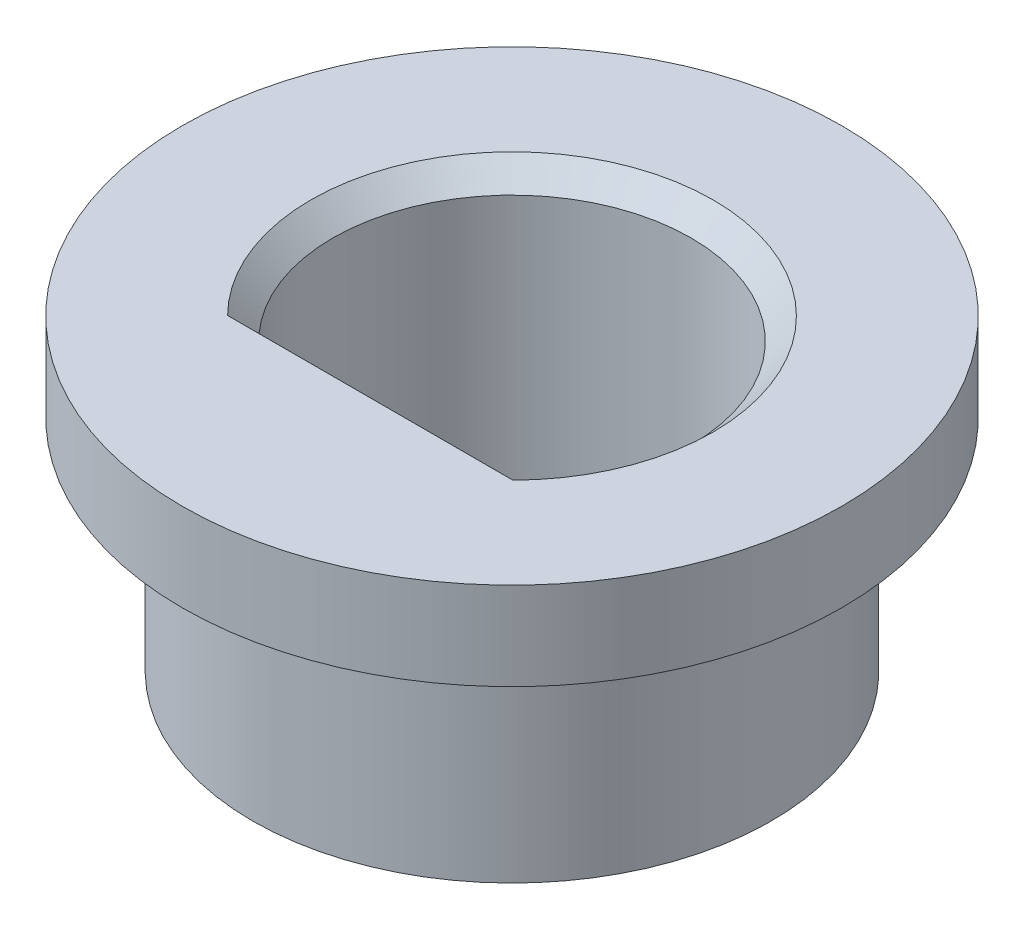
ISO-10303-21;
HEADER;
FILE_DESCRIPTION(('STEP AP214'),'2;1');
FILE_NAME('part.step','',(''),(''),'','','');
FILE_SCHEMA(('AUTOMOTIVE_DESIGN { 1 0 10303 214 1 1 1 1 }'));
ENDSEC;
DATA;
#1=APPLICATION_CONTEXT('core data for automotive mechanical design processes');
#2=APPLICATION_PROTOCOL_DEFINITION('international standard','automotive_design',2000,#1);
#3=PRODUCT_CONTEXT('',#1,'mechanical');
#4=PRODUCT('Part','Part','',(#3));
#5=PRODUCT_RELATED_PRODUCT_CATEGORY('part','',(#4));
#6=PRODUCT_DEFINITION_FORMATION('','',#4);
#7=PRODUCT_DEFINITION_CONTEXT('part definition',#1,'design');
#8=PRODUCT_DEFINITION('design','',#6,#7);
#9=PRODUCT_DEFINITION_SHAPE('','',#8);
#10=(LENGTH_UNIT() NAMED_UNIT(*) SI_UNIT(.MILLI.,.METRE.));
#11=(NAMED_UNIT(*) PLANE_ANGLE_UNIT() SI_UNIT($,.RADIAN.));
#12=(NAMED_UNIT(*) SI_UNIT($,.STERADIAN.) SOLID_ANGLE_UNIT());
#13=UNCERTAINTY_MEASURE_WITH_UNIT(LENGTH_MEASURE(1.E-05),#10,'distance_accuracy_value','');
#14=(GEOMETRIC_REPRESENTATION_CONTEXT(3) GLOBAL_UNCERTAINTY_ASSIGNED_CONTEXT((#13)) GLOBAL_UNIT_ASSIGNED_CONTEXT((#10,
#11,#12)) REPRESENTATION_CONTEXT('',''));
#15=CARTESIAN_POINT('',(0.,0.,0.));
#16=DIRECTION('',(0.,0.,1.));
#17=DIRECTION('',(1.,0.,0.));
#18=AXIS2_PLACEMENT_3D('',#15,#16,#17);
#19=CARTESIAN_POINT('',(0.,0.,0.));
#20=DIRECTION('',(0.,1.,0.));
#21=DIRECTION('',(0.,0.,1.));
#22=AXIS2_PLACEMENT_3D('',#19,#20,#21);
#23=PLANE('',#22);
#24=DIRECTION('',(1.,0.,0.));
#25=VECTOR('',#24,1.);
#26=CARTESIAN_POINT('',(-3.02985148150862,0.,2.725));
#27=LINE('',#26,#25);
#28=CARTESIAN_POINT('',(-3.02985148150862,0.,2.725));
#29=VERTEX_POINT('',#28);
#30=CARTESIAN_POINT('',(3.02985148150862,0.,2.725));
#31=VERTEX_POINT('',#30);
#32=EDGE_CURVE('E92',#29,#31,#27,.T.);
#33=ORIENTED_EDGE('',*,*,#32,.T.);
#34=CARTESIAN_POINT('',(0.,0.,0.));
#35=DIRECTION('',(0.,1.,0.));
#36=DIRECTION('',(0.,0.,1.));
#37=AXIS2_PLACEMENT_3D('',#34,#35,#36);
#38=CIRCLE('',#37,4.075);
#39=EDGE_CURVE('E90',#31,#29,#38,.T.);
#40=ORIENTED_EDGE('',*,*,#39,.T.);
#41=EDGE_LOOP('',(#33,#40));
#42=FACE_BOUND('',#41,.T.);
#43=CARTESIAN_POINT('',(0.,0.,0.));
#44=DIRECTION('',(0.,1.,0.));
#45=DIRECTION('',(0.,0.,1.));
#46=AXIS2_PLACEMENT_3D('',#43,#44,#45);
#47=CIRCLE('',#46,5.9);
#48=CARTESIAN_POINT('',(0.,0.,5.9));
#49=VERTEX_POINT('',#48);
#50=EDGE_CURVE('E113',#49,#49,#47,.T.);
#51=ORIENTED_EDGE('',*,*,#50,.F.);
#52=EDGE_LOOP('',(#51));
#53=FACE_BOUND('',#52,.T.);
#54=ADVANCED_FACE('F43',(#42,#53),#23,.F.);
#55=CARTESIAN_POINT('',(0.,0.,0.));
#56=DIRECTION('',(0.,1.,0.));
#57=DIRECTION('',(0.,0.,1.));
#58=AXIS2_PLACEMENT_3D('',#55,#56,#57);
#59=CYLINDRICAL_SURFACE('',#58,5.9);
#60=CARTESIAN_POINT('',(0.,5.,0.));
#61=DIRECTION('',(0.,1.,0.));
#62=DIRECTION('',(0.,0.,1.));
#63=AXIS2_PLACEMENT_3D('',#60,#61,#62);
#64=CIRCLE('',#63,5.9);
#65=CARTESIAN_POINT('',(0.,5.,5.9));
#66=VERTEX_POINT('',#65);
#67=EDGE_CURVE('E115',#66,#66,#64,.T.);
#68=ORIENTED_EDGE('',*,*,#67,.F.);
#69=EDGE_LOOP('',(#68));
#70=FACE_BOUND('',#69,.T.);
#71=ORIENTED_EDGE('',*,*,#50,.T.);
#72=EDGE_LOOP('',(#71));
#73=FACE_BOUND('',#72,.T.);
#74=ADVANCED_FACE('F132',(#70,#73),#59,.T.);
#75=CARTESIAN_POINT('',(5.9,5.,0.));
#76=DIRECTION('',(0.,1.,0.));
#77=DIRECTION('',(0.,0.,1.));
#78=AXIS2_PLACEMENT_3D('',#75,#76,#77);
#79=PLANE('',#78);
#80=CARTESIAN_POINT('',(0.,5.,0.));
#81=DIRECTION('',(0.,1.,0.));
#82=DIRECTION('',(0.,0.,1.));
#83=AXIS2_PLACEMENT_3D('',#80,#81,#82);
#84=CIRCLE('',#83,7.5);
#85=CARTESIAN_POINT('',(0.,5.,7.5));
#86=VERTEX_POINT('',#85);
#87=EDGE_CURVE('E108',#86,#86,#84,.T.);
#88=ORIENTED_EDGE('',*,*,#87,.F.);
#89=EDGE_LOOP('',(#88));
#90=FACE_BOUND('',#89,.T.);
#91=ORIENTED_EDGE('',*,*,#67,.T.);
#92=EDGE_LOOP('',(#91));
#93=FACE_BOUND('',#92,.T.);
#94=ADVANCED_FACE('F137',(#90,#93),#79,.F.);
#95=CARTESIAN_POINT('',(0.,0.,0.));
#96=DIRECTION('',(0.,1.,0.));
#97=DIRECTION('',(0.,0.,1.));
#98=AXIS2_PLACEMENT_3D('',#95,#96,#97);
#99=CYLINDRICAL_SURFACE('',#98,7.5);
#100=CARTESIAN_POINT('',(0.,7.,0.));
#101=DIRECTION('',(0.,1.,0.));
#102=DIRECTION('',(0.,0.,1.));
#103=AXIS2_PLACEMENT_3D('',#100,#101,#102);
#104=CIRCLE('',#103,7.5);
#105=CARTESIAN_POINT('',(0.,7.,7.5));
#106=VERTEX_POINT('',#105);
#107=EDGE_CURVE('E104',#106,#106,#104,.T.);
#108=ORIENTED_EDGE('',*,*,#107,.F.);
#109=EDGE_LOOP('',(#108));
#110=FACE_BOUND('',#109,.T.);
#111=ORIENTED_EDGE('',*,*,#87,.T.);
#112=EDGE_LOOP('',(#111));
#113=FACE_BOUND('',#112,.T.);
#114=ADVANCED_FACE('F142',(#110,#113),#99,.T.);
#115=CARTESIAN_POINT('',(7.5,7.,0.));
#116=DIRECTION('',(0.,-1.,0.));
#117=DIRECTION('',(0.,0.,-1.));
#118=AXIS2_PLACEMENT_3D('',#115,#116,#117);
#119=PLANE('',#118);
#120=CARTESIAN_POINT('',(0.,7.,0.));
#121=DIRECTION('',(0.,-1.,0.));
#122=DIRECTION('',(0.,0.,-1.));
#123=AXIS2_PLACEMENT_3D('',#120,#121,#122);
#124=CIRCLE('',#123,4.57500000000002);
#125=CARTESIAN_POINT('',(-3.24499614791835,7.,3.22499999999926));
#126=VERTEX_POINT('',#125);
#127=CARTESIAN_POINT('',(3.24499614791835,7.,3.22499999999926));
#128=VERTEX_POINT('',#127);
#129=EDGE_CURVE('E62',#126,#128,#124,.T.);
#130=ORIENTED_EDGE('',*,*,#129,.T.);
#131=DIRECTION('',(-1.,0.,0.));
#132=VECTOR('',#131,1.);
#133=CARTESIAN_POINT('',(7.5,7.,3.22500000000001));
#134=LINE('',#133,#132);
#135=EDGE_CURVE('E59',#128,#126,#134,.T.);
#136=ORIENTED_EDGE('',*,*,#135,.T.);
#137=EDGE_LOOP('',(#130,#136));
#138=FACE_BOUND('',#137,.T.);
#139=ORIENTED_EDGE('',*,*,#107,.T.);
#140=EDGE_LOOP('',(#139));
#141=FACE_BOUND('',#140,.T.);
#142=ADVANCED_FACE('F148',(#138,#141),#119,.F.);
#143=CARTESIAN_POINT('',(0.,0.,0.));
#144=DIRECTION('',(0.,1.,0.));
#145=DIRECTION('',(0.,0.,1.));
#146=AXIS2_PLACEMENT_3D('',#143,#144,#145);
#147=CYLINDRICAL_SURFACE('',#146,4.075);
#148=DIRECTION('',(0.,1.,0.));
#149=VECTOR('',#148,1.);
#150=CARTESIAN_POINT('',(3.02985148150862,0.,2.725));
#151=LINE('',#150,#149);
#152=CARTESIAN_POINT('',(3.02985148150862,6.49999999999999,2.725));
#153=VERTEX_POINT('',#152);
#154=EDGE_CURVE('E94',#31,#153,#151,.T.);
#155=ORIENTED_EDGE('',*,*,#154,.T.);
#156=CARTESIAN_POINT('',(0.,6.49999999999999,0.));
#157=DIRECTION('',(0.,-1.,0.));
#158=DIRECTION('',(0.,0.,-1.));
#159=AXIS2_PLACEMENT_3D('',#156,#157,#158);
#160=CIRCLE('',#159,4.075);
#161=CARTESIAN_POINT('',(-3.02985148150862,6.49999999999999,2.725));
#162=VERTEX_POINT('',#161);
#163=EDGE_CURVE('E11',#153,#162,#160,.F.);
#164=ORIENTED_EDGE('',*,*,#163,.T.);
#165=DIRECTION('',(0.,1.,0.));
#166=VECTOR('',#165,1.);
#167=CARTESIAN_POINT('',(-3.02985148150862,0.,2.725));
#168=LINE('',#167,#166);
#169=EDGE_CURVE('E83',#29,#162,#168,.T.);
#170=ORIENTED_EDGE('',*,*,#169,.F.);
#171=ORIENTED_EDGE('',*,*,#39,.F.);
#172=EDGE_LOOP('',(#155,#164,#170,#171));
#173=FACE_BOUND('',#172,.T.);
#174=ADVANCED_FACE('F87',(#173),#147,.F.);
#175=CARTESIAN_POINT('',(-3.02985148150862,0.,2.725));
#176=DIRECTION('',(0.,0.,1.));
#177=DIRECTION('',(1.,0.,0.));
#178=AXIS2_PLACEMENT_3D('',#175,#176,#177);
#179=PLANE('',#178);
#180=ORIENTED_EDGE('',*,*,#169,.T.);
#181=DIRECTION('',(1.,0.,0.));
#182=VECTOR('',#181,1.);
#183=CARTESIAN_POINT('',(-3.02985148150862,6.49999999999999,2.725));
#184=LINE('',#183,#182);
#185=EDGE_CURVE('E116',#162,#153,#184,.T.);
#186=ORIENTED_EDGE('',*,*,#185,.T.);
#187=ORIENTED_EDGE('',*,*,#154,.F.);
#188=ORIENTED_EDGE('',*,*,#32,.F.);
#189=EDGE_LOOP('',(#180,#186,#187,#188));
#190=FACE_BOUND('',#189,.T.);
#191=ADVANCED_FACE('F98',(#190),#179,.F.);
#192=CARTESIAN_POINT('',(0.,6.49999999999999,0.));
#193=DIRECTION('',(0.,1.,0.));
#194=DIRECTION('',(0.,0.,1.));
#195=AXIS2_PLACEMENT_3D('',#192,#193,#194);
#196=CONICAL_SURFACE('',#195,4.075,0.785398163397452);
#197=CARTESIAN_POINT('',(3.02985148150862,6.49999999999999,2.725));
#198=CARTESIAN_POINT('',(3.06683396496444,6.58309140714482,2.80809140714484));
#199=CARTESIAN_POINT('',(3.10325395177358,6.66630383244034,2.89130383244035));
#200=CARTESIAN_POINT('',(3.1749688376122,6.83297049974489,3.0579704997449));
#201=CARTESIAN_POINT('',(3.2102637396061,6.91642474111615,3.14142474111617));
#202=CARTESIAN_POINT('',(3.24499614791773,7.00000000000031,3.22500000000032));
#203=B_SPLINE_CURVE_WITH_KNOTS('',3,(#197,#198,#199,#200,#201,#202),.UNSPECIFIED.,.F.,.F.,(4,2,
4),(0.,0.369560925933331,0.739120878055016),.UNSPECIFIED.);
#204=EDGE_CURVE('E103',#128,#153,#203,.F.);
#205=ORIENTED_EDGE('',*,*,#204,.F.);
#206=ORIENTED_EDGE('',*,*,#129,.F.);
#207=CARTESIAN_POINT('',(-3.24499614791912,7.,3.22500000000001));
#208=CARTESIAN_POINT('',(-3.21026373960646,6.91642474111607,3.14142474111608));
#209=CARTESIAN_POINT('',(-3.1749688376121,6.83297049974491,3.05797049974492));
#210=CARTESIAN_POINT('',(-3.10325395177367,6.66630383244032,2.89130383244034));
#211=CARTESIAN_POINT('',(-3.0668339649652,6.58309140714467,2.80809140714468));
#212=CARTESIAN_POINT('',(-3.0298514815106,6.49999999999957,2.72499999999959));
#213=B_SPLINE_CURVE_WITH_KNOTS('',3,(#207,#208,#209,#210,#211,#212),.UNSPECIFIED.,.F.,.F.,(4,2,
4),(0.,0.369559952121662,0.739120878054966),.UNSPECIFIED.);
#214=EDGE_CURVE('E47',#162,#126,#213,.F.);
#215=ORIENTED_EDGE('',*,*,#214,.F.);
#216=ORIENTED_EDGE('',*,*,#163,.F.);
#217=EDGE_LOOP('',(#205,#206,#215,#216));
#218=FACE_BOUND('',#217,.T.);
#219=ADVANCED_FACE('F46',(#218),#196,.F.);
#220=CARTESIAN_POINT('',(-3.02985148150862,6.49999999999999,2.725));
#221=DIRECTION('',(0.,-0.70710678118655,0.707106781186545));
#222=DIRECTION('',(1.,0.,0.));
#223=AXIS2_PLACEMENT_3D('',#220,#221,#222);
#224=PLANE('',#223);
#225=ORIENTED_EDGE('',*,*,#214,.T.);
#226=ORIENTED_EDGE('',*,*,#135,.F.);
#227=ORIENTED_EDGE('',*,*,#204,.T.);
#228=ORIENTED_EDGE('',*,*,#185,.F.);
#229=EDGE_LOOP('',(#225,#226,#227,#228));
#230=FACE_BOUND('',#229,.T.);
#231=ADVANCED_FACE('F127',(#230),#224,.F.);
#232=CLOSED_SHELL('',(#54,#74,#94,#114,#142,#174,#191,#219,#231));
#233=MANIFOLD_SOLID_BREP('B2',#232);
#234=ADVANCED_BREP_SHAPE_REPRESENTATION('',(#18,#233),#14);
#235=SHAPE_DEFINITION_REPRESENTATION(#9,#234);
ENDSEC;
END-ISO-10303-21;
